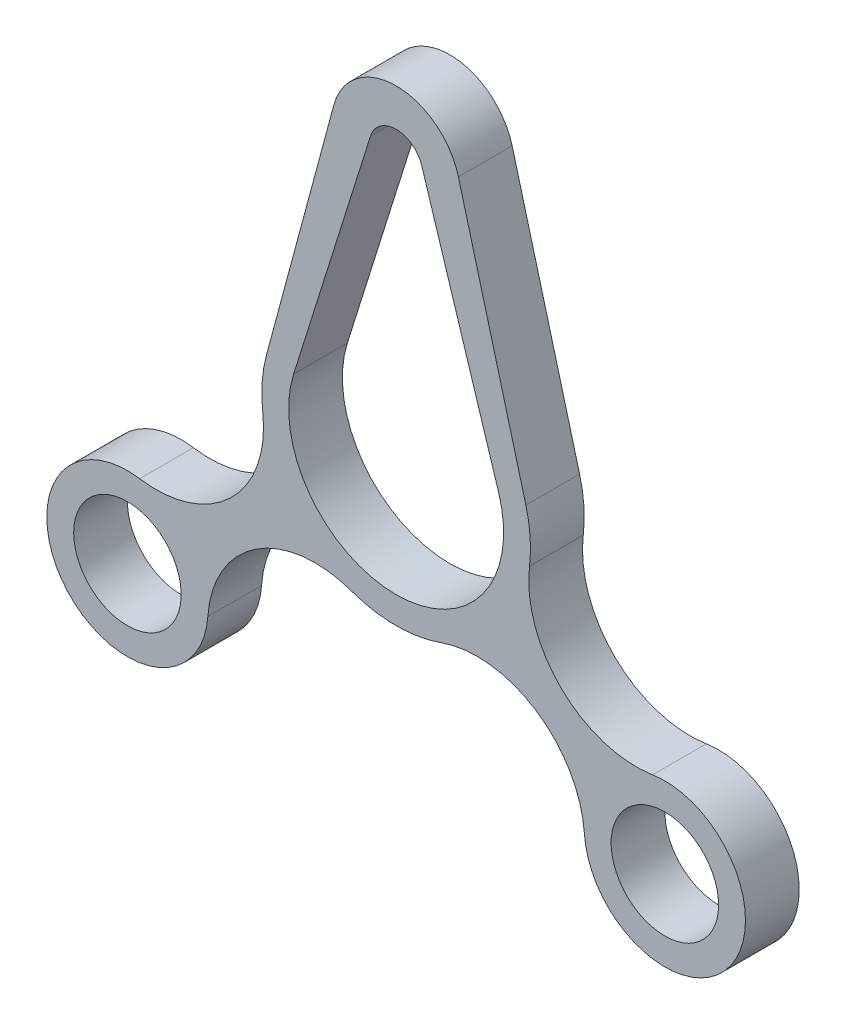
ISO-10303-21;
HEADER;
FILE_DESCRIPTION(('STEP AP214'),'2;1');
FILE_NAME('part.step','',(''),(''),'','','');
FILE_SCHEMA(('AUTOMOTIVE_DESIGN { 1 0 10303 214 1 1 1 1 }'));
ENDSEC;
DATA;
#1=APPLICATION_CONTEXT('core data for automotive mechanical design processes');
#2=APPLICATION_PROTOCOL_DEFINITION('international standard','automotive_design',2000,#1);
#3=PRODUCT_CONTEXT('',#1,'mechanical');
#4=PRODUCT('Part','Part','',(#3));
#5=PRODUCT_RELATED_PRODUCT_CATEGORY('part','',(#4));
#6=PRODUCT_DEFINITION_FORMATION('','',#4);
#7=PRODUCT_DEFINITION_CONTEXT('part definition',#1,'design');
#8=PRODUCT_DEFINITION('design','',#6,#7);
#9=PRODUCT_DEFINITION_SHAPE('','',#8);
#10=(LENGTH_UNIT() NAMED_UNIT(*) SI_UNIT(.MILLI.,.METRE.));
#11=(NAMED_UNIT(*) PLANE_ANGLE_UNIT() SI_UNIT($,.RADIAN.));
#12=(NAMED_UNIT(*) SI_UNIT($,.STERADIAN.) SOLID_ANGLE_UNIT());
#13=UNCERTAINTY_MEASURE_WITH_UNIT(LENGTH_MEASURE(1.E-05),#10,'distance_accuracy_value','');
#14=(GEOMETRIC_REPRESENTATION_CONTEXT(3) GLOBAL_UNCERTAINTY_ASSIGNED_CONTEXT((#13)) GLOBAL_UNIT_ASSIGNED_CONTEXT((#10,
#11,#12)) REPRESENTATION_CONTEXT('',''));
#15=CARTESIAN_POINT('',(0.,0.,0.));
#16=DIRECTION('',(0.,0.,1.));
#17=DIRECTION('',(1.,0.,0.));
#18=AXIS2_PLACEMENT_3D('',#15,#16,#17);
#19=CARTESIAN_POINT('',(0.,0.,5.));
#20=DIRECTION('',(0.,0.,1.));
#21=DIRECTION('',(1.,0.,0.));
#22=AXIS2_PLACEMENT_3D('',#19,#20,#21);
#23=PLANE('',#22);
#24=CARTESIAN_POINT('',(50.,-40.,5.));
#25=DIRECTION('',(0.,0.,1.));
#26=DIRECTION('',(1.,0.,0.));
#27=AXIS2_PLACEMENT_3D('',#24,#25,#26);
#28=CIRCLE('',#27,9.99999999999999);
#29=CARTESIAN_POINT('',(60.,-40.,5.));
#30=VERTEX_POINT('',#29);
#31=EDGE_CURVE('E213',#30,#30,#28,.T.);
#32=ORIENTED_EDGE('',*,*,#31,.F.);
#33=EDGE_LOOP('',(#32));
#34=FACE_BOUND('',#33,.T.);
#35=CARTESIAN_POINT('',(0.,0.,5.));
#36=DIRECTION('',(0.,0.,1.));
#37=DIRECTION('',(1.,0.,0.));
#38=AXIS2_PLACEMENT_3D('',#35,#36,#37);
#39=CIRCLE('',#38,25.);
#40=CARTESIAN_POINT('',(-8.37899680861621,-23.5540317670075,5.));
#41=VERTEX_POINT('',#40);
#42=CARTESIAN_POINT('',(8.37899680861621,-23.5540317670075,5.));
#43=VERTEX_POINT('',#42);
#44=EDGE_CURVE('E221',#41,#43,#39,.T.);
#45=ORIENTED_EDGE('',*,*,#44,.T.);
#46=CARTESIAN_POINT('',(15.0821942555092,-42.3972571806135,5.));
#47=DIRECTION('',(0.,0.,-1.));
#48=DIRECTION('',(-1.,0.,0.));
#49=AXIS2_PLACEMENT_3D('',#46,#47,#48);
#50=CIRCLE('',#49,20.);
#51=CARTESIAN_POINT('',(35.0352261095039,-41.0273959345487,5.));
#52=VERTEX_POINT('',#51);
#53=EDGE_CURVE('E225',#43,#52,#50,.T.);
#54=ORIENTED_EDGE('',*,*,#53,.T.);
#55=CARTESIAN_POINT('',(50.,-40.,5.));
#56=DIRECTION('',(0.,0.,1.));
#57=DIRECTION('',(1.,0.,0.));
#58=AXIS2_PLACEMENT_3D('',#55,#56,#57);
#59=CIRCLE('',#58,15.);
#60=CARTESIAN_POINT('',(47.7173871309142,-25.1746946577858,5.));
#61=VERTEX_POINT('',#60);
#62=EDGE_CURVE('E229',#52,#61,#59,.T.);
#63=ORIENTED_EDGE('',*,*,#62,.T.);
#64=CARTESIAN_POINT('',(44.6739033054664,-5.40762086816695,5.));
#65=DIRECTION('',(0.,0.,-1.));
#66=DIRECTION('',(1.,0.,0.));
#67=AXIS2_PLACEMENT_3D('',#64,#65,#66);
#68=CIRCLE('',#67,20.);
#69=CARTESIAN_POINT('',(24.8188351697036,-3.00423381564831,5.));
#70=VERTEX_POINT('',#69);
#71=EDGE_CURVE('E232',#61,#70,#68,.T.);
#72=ORIENTED_EDGE('',*,*,#71,.T.);
#73=CARTESIAN_POINT('',(0.,0.,5.));
#74=DIRECTION('',(0.,0.,1.));
#75=DIRECTION('',(1.,0.,0.));
#76=AXIS2_PLACEMENT_3D('',#73,#74,#75);
#77=CIRCLE('',#76,25.);
#78=CARTESIAN_POINT('',(24.1402154091466,6.5,5.));
#79=VERTEX_POINT('',#78);
#80=EDGE_CURVE('E235',#70,#79,#77,.T.);
#81=ORIENTED_EDGE('',*,*,#80,.T.);
#82=DIRECTION('',(-0.26,0.965608616365865,0.));
#83=VECTOR('',#82,1.);
#84=CARTESIAN_POINT('',(11.5873033963904,53.12,5.));
#85=LINE('',#84,#83);
#86=CARTESIAN_POINT('',(11.5873033963904,53.12,5.));
#87=VERTEX_POINT('',#86);
#88=EDGE_CURVE('E238',#79,#87,#85,.T.);
#89=ORIENTED_EDGE('',*,*,#88,.T.);
#90=CARTESIAN_POINT('',(0.,50.,5.));
#91=DIRECTION('',(0.,0.,1.));
#92=DIRECTION('',(1.,0.,0.));
#93=AXIS2_PLACEMENT_3D('',#90,#91,#92);
#94=CIRCLE('',#93,12.);
#95=CARTESIAN_POINT('',(-11.5873033963904,53.12,5.));
#96=VERTEX_POINT('',#95);
#97=EDGE_CURVE('E241',#87,#96,#94,.T.);
#98=ORIENTED_EDGE('',*,*,#97,.T.);
#99=DIRECTION('',(-0.26,-0.965608616365865,0.));
#100=VECTOR('',#99,1.);
#101=CARTESIAN_POINT('',(-11.5873033963904,53.12,5.));
#102=LINE('',#101,#100);
#103=CARTESIAN_POINT('',(-24.1402154091466,6.5,5.));
#104=VERTEX_POINT('',#103);
#105=EDGE_CURVE('E244',#96,#104,#102,.T.);
#106=ORIENTED_EDGE('',*,*,#105,.T.);
#107=CARTESIAN_POINT('',(0.,0.,5.));
#108=DIRECTION('',(0.,0.,1.));
#109=DIRECTION('',(1.,0.,0.));
#110=AXIS2_PLACEMENT_3D('',#107,#108,#109);
#111=CIRCLE('',#110,25.);
#112=CARTESIAN_POINT('',(-24.8188351697036,-3.0042338156483,5.));
#113=VERTEX_POINT('',#112);
#114=EDGE_CURVE('E247',#104,#113,#111,.T.);
#115=ORIENTED_EDGE('',*,*,#114,.T.);
#116=CARTESIAN_POINT('',(-44.6739033054664,-5.40762086816695,5.));
#117=DIRECTION('',(0.,0.,-1.));
#118=DIRECTION('',(-1.,0.,0.));
#119=AXIS2_PLACEMENT_3D('',#116,#117,#118);
#120=CIRCLE('',#119,20.);
#121=CARTESIAN_POINT('',(-47.7173871309142,-25.1746946577858,5.));
#122=VERTEX_POINT('',#121);
#123=EDGE_CURVE('E250',#113,#122,#120,.T.);
#124=ORIENTED_EDGE('',*,*,#123,.T.);
#125=CARTESIAN_POINT('',(-50.,-40.,5.));
#126=DIRECTION('',(0.,0.,1.));
#127=DIRECTION('',(-1.,0.,0.));
#128=AXIS2_PLACEMENT_3D('',#125,#126,#127);
#129=CIRCLE('',#128,15.);
#130=CARTESIAN_POINT('',(-35.0352261095039,-41.0273959345487,5.));
#131=VERTEX_POINT('',#130);
#132=EDGE_CURVE('E253',#122,#131,#129,.T.);
#133=ORIENTED_EDGE('',*,*,#132,.T.);
#134=CARTESIAN_POINT('',(-15.0821942555092,-42.3972571806135,5.));
#135=DIRECTION('',(0.,0.,-1.));
#136=DIRECTION('',(1.,0.,0.));
#137=AXIS2_PLACEMENT_3D('',#134,#135,#136);
#138=CIRCLE('',#137,20.);
#139=EDGE_CURVE('E256',#131,#41,#138,.T.);
#140=ORIENTED_EDGE('',*,*,#139,.T.);
#141=EDGE_LOOP('',(#45,#54,#63,#72,#81,#89,#98,#106,#115,#124,#133,#140));
#142=FACE_BOUND('',#141,.T.);
#143=CARTESIAN_POINT('',(-50.,-40.,5.));
#144=DIRECTION('',(0.,0.,1.));
#145=DIRECTION('',(-1.,0.,0.));
#146=AXIS2_PLACEMENT_3D('',#143,#144,#145);
#147=CIRCLE('',#146,9.99999999999999);
#148=CARTESIAN_POINT('',(-60.,-40.,5.));
#149=VERTEX_POINT('',#148);
#150=EDGE_CURVE('E205',#149,#149,#147,.T.);
#151=ORIENTED_EDGE('',*,*,#150,.F.);
#152=EDGE_LOOP('',(#151));
#153=FACE_BOUND('',#152,.T.);
#154=DIRECTION('',(-0.3,-0.953939201416946,0.));
#155=VECTOR('',#154,1.);
#156=CARTESIAN_POINT('',(-4.76969600708473,51.5,5.));
#157=LINE('',#156,#155);
#158=CARTESIAN_POINT('',(-4.76969600708473,51.5,5.));
#159=VERTEX_POINT('',#158);
#160=CARTESIAN_POINT('',(-19.0787840283389,6.,5.));
#161=VERTEX_POINT('',#160);
#162=EDGE_CURVE('E166',#159,#161,#157,.T.);
#163=ORIENTED_EDGE('',*,*,#162,.F.);
#164=CARTESIAN_POINT('',(0.,50.,5.));
#165=DIRECTION('',(0.,0.,1.));
#166=DIRECTION('',(1.,0.,0.));
#167=AXIS2_PLACEMENT_3D('',#164,#165,#166);
#168=CIRCLE('',#167,5.);
#169=CARTESIAN_POINT('',(4.76969600708473,51.5,5.));
#170=VERTEX_POINT('',#169);
#171=EDGE_CURVE('E157',#170,#159,#168,.T.);
#172=ORIENTED_EDGE('',*,*,#171,.F.);
#173=DIRECTION('',(-0.3,0.953939201416946,0.));
#174=VECTOR('',#173,1.);
#175=CARTESIAN_POINT('',(4.76969600708473,51.5,5.));
#176=LINE('',#175,#174);
#177=CARTESIAN_POINT('',(19.0787840283389,6.,5.));
#178=VERTEX_POINT('',#177);
#179=EDGE_CURVE('E183',#178,#170,#176,.T.);
#180=ORIENTED_EDGE('',*,*,#179,.F.);
#181=CARTESIAN_POINT('',(0.,0.,5.));
#182=DIRECTION('',(0.,0.,1.));
#183=DIRECTION('',(1.,0.,0.));
#184=AXIS2_PLACEMENT_3D('',#181,#182,#183);
#185=CIRCLE('',#184,20.);
#186=EDGE_CURVE('E179',#161,#178,#185,.T.);
#187=ORIENTED_EDGE('',*,*,#186,.F.);
#188=EDGE_LOOP('',(#163,#172,#180,#187));
#189=FACE_BOUND('',#188,.T.);
#190=ADVANCED_FACE('F43',(#34,#142,#153,#189),#23,.T.);
#191=CARTESIAN_POINT('',(0.,0.,-5.));
#192=DIRECTION('',(0.,0.,1.));
#193=DIRECTION('',(1.,0.,0.));
#194=AXIS2_PLACEMENT_3D('',#191,#192,#193);
#195=PLANE('',#194);
#196=CARTESIAN_POINT('',(-50.,-40.,-5.));
#197=DIRECTION('',(0.,0.,1.));
#198=DIRECTION('',(-1.,0.,0.));
#199=AXIS2_PLACEMENT_3D('',#196,#197,#198);
#200=CIRCLE('',#199,9.99999999999999);
#201=CARTESIAN_POINT('',(-60.,-40.,-5.));
#202=VERTEX_POINT('',#201);
#203=EDGE_CURVE('E175',#202,#202,#200,.T.);
#204=ORIENTED_EDGE('',*,*,#203,.T.);
#205=EDGE_LOOP('',(#204));
#206=FACE_BOUND('',#205,.T.);
#207=CARTESIAN_POINT('',(50.,-40.,-5.));
#208=DIRECTION('',(0.,0.,1.));
#209=DIRECTION('',(1.,0.,0.));
#210=AXIS2_PLACEMENT_3D('',#207,#208,#209);
#211=CIRCLE('',#210,9.99999999999999);
#212=CARTESIAN_POINT('',(60.,-40.,-5.));
#213=VERTEX_POINT('',#212);
#214=EDGE_CURVE('E209',#213,#213,#211,.T.);
#215=ORIENTED_EDGE('',*,*,#214,.T.);
#216=EDGE_LOOP('',(#215));
#217=FACE_BOUND('',#216,.T.);
#218=CARTESIAN_POINT('',(0.,0.,-5.));
#219=DIRECTION('',(0.,0.,1.));
#220=DIRECTION('',(1.,0.,0.));
#221=AXIS2_PLACEMENT_3D('',#218,#219,#220);
#222=CIRCLE('',#221,25.);
#223=CARTESIAN_POINT('',(-8.37899680861621,-23.5540317670075,-5.));
#224=VERTEX_POINT('',#223);
#225=CARTESIAN_POINT('',(8.37899680861621,-23.5540317670075,-5.));
#226=VERTEX_POINT('',#225);
#227=EDGE_CURVE('E217',#224,#226,#222,.T.);
#228=ORIENTED_EDGE('',*,*,#227,.F.);
#229=CARTESIAN_POINT('',(-15.0821942555092,-42.3972571806135,-5.));
#230=DIRECTION('',(0.,0.,-1.));
#231=DIRECTION('',(1.,0.,0.));
#232=AXIS2_PLACEMENT_3D('',#229,#230,#231);
#233=CIRCLE('',#232,20.);
#234=CARTESIAN_POINT('',(-35.0352261095039,-41.0273959345487,-5.));
#235=VERTEX_POINT('',#234);
#236=EDGE_CURVE('E226',#235,#224,#233,.T.);
#237=ORIENTED_EDGE('',*,*,#236,.F.);
#238=CARTESIAN_POINT('',(-50.,-40.,-5.));
#239=DIRECTION('',(0.,0.,1.));
#240=DIRECTION('',(-1.,0.,0.));
#241=AXIS2_PLACEMENT_3D('',#238,#239,#240);
#242=CIRCLE('',#241,15.);
#243=CARTESIAN_POINT('',(-47.7173871309142,-25.1746946577858,-5.));
#244=VERTEX_POINT('',#243);
#245=EDGE_CURVE('E290',#244,#235,#242,.T.);
#246=ORIENTED_EDGE('',*,*,#245,.F.);
#247=CARTESIAN_POINT('',(-44.6739033054664,-5.40762086816695,-5.));
#248=DIRECTION('',(0.,0.,-1.));
#249=DIRECTION('',(-1.,0.,0.));
#250=AXIS2_PLACEMENT_3D('',#247,#248,#249);
#251=CIRCLE('',#250,20.);
#252=CARTESIAN_POINT('',(-24.8188351697036,-3.0042338156483,-5.));
#253=VERTEX_POINT('',#252);
#254=EDGE_CURVE('E287',#253,#244,#251,.T.);
#255=ORIENTED_EDGE('',*,*,#254,.F.);
#256=CARTESIAN_POINT('',(0.,0.,-5.));
#257=DIRECTION('',(0.,0.,1.));
#258=DIRECTION('',(1.,0.,0.));
#259=AXIS2_PLACEMENT_3D('',#256,#257,#258);
#260=CIRCLE('',#259,25.);
#261=CARTESIAN_POINT('',(-24.1402154091466,6.5,-5.));
#262=VERTEX_POINT('',#261);
#263=EDGE_CURVE('E284',#262,#253,#260,.T.);
#264=ORIENTED_EDGE('',*,*,#263,.F.);
#265=DIRECTION('',(-0.26,-0.965608616365865,0.));
#266=VECTOR('',#265,1.);
#267=CARTESIAN_POINT('',(-11.5873033963904,53.12,-5.));
#268=LINE('',#267,#266);
#269=CARTESIAN_POINT('',(-11.5873033963904,53.12,-5.));
#270=VERTEX_POINT('',#269);
#271=EDGE_CURVE('E281',#270,#262,#268,.T.);
#272=ORIENTED_EDGE('',*,*,#271,.F.);
#273=CARTESIAN_POINT('',(0.,50.,-5.));
#274=DIRECTION('',(0.,0.,1.));
#275=DIRECTION('',(1.,0.,0.));
#276=AXIS2_PLACEMENT_3D('',#273,#274,#275);
#277=CIRCLE('',#276,12.);
#278=CARTESIAN_POINT('',(11.5873033963904,53.12,-5.));
#279=VERTEX_POINT('',#278);
#280=EDGE_CURVE('E278',#279,#270,#277,.T.);
#281=ORIENTED_EDGE('',*,*,#280,.F.);
#282=DIRECTION('',(-0.26,0.965608616365865,0.));
#283=VECTOR('',#282,1.);
#284=CARTESIAN_POINT('',(11.5873033963904,53.12,-5.));
#285=LINE('',#284,#283);
#286=CARTESIAN_POINT('',(24.1402154091466,6.5,-5.));
#287=VERTEX_POINT('',#286);
#288=EDGE_CURVE('E275',#287,#279,#285,.T.);
#289=ORIENTED_EDGE('',*,*,#288,.F.);
#290=CARTESIAN_POINT('',(0.,0.,-5.));
#291=DIRECTION('',(0.,0.,1.));
#292=DIRECTION('',(1.,0.,0.));
#293=AXIS2_PLACEMENT_3D('',#290,#291,#292);
#294=CIRCLE('',#293,25.);
#295=CARTESIAN_POINT('',(24.8188351697036,-3.00423381564831,-5.));
#296=VERTEX_POINT('',#295);
#297=EDGE_CURVE('E272',#296,#287,#294,.T.);
#298=ORIENTED_EDGE('',*,*,#297,.F.);
#299=CARTESIAN_POINT('',(44.6739033054664,-5.40762086816695,-5.));
#300=DIRECTION('',(0.,0.,-1.));
#301=DIRECTION('',(1.,0.,0.));
#302=AXIS2_PLACEMENT_3D('',#299,#300,#301);
#303=CIRCLE('',#302,20.);
#304=CARTESIAN_POINT('',(47.7173871309142,-25.1746946577858,-5.));
#305=VERTEX_POINT('',#304);
#306=EDGE_CURVE('E269',#305,#296,#303,.T.);
#307=ORIENTED_EDGE('',*,*,#306,.F.);
#308=CARTESIAN_POINT('',(50.,-40.,-5.));
#309=DIRECTION('',(0.,0.,1.));
#310=DIRECTION('',(1.,0.,0.));
#311=AXIS2_PLACEMENT_3D('',#308,#309,#310);
#312=CIRCLE('',#311,15.);
#313=CARTESIAN_POINT('',(35.0352261095039,-41.0273959345487,-5.));
#314=VERTEX_POINT('',#313);
#315=EDGE_CURVE('E266',#314,#305,#312,.T.);
#316=ORIENTED_EDGE('',*,*,#315,.F.);
#317=CARTESIAN_POINT('',(15.0821942555092,-42.3972571806135,-5.));
#318=DIRECTION('',(0.,0.,-1.));
#319=DIRECTION('',(-1.,0.,0.));
#320=AXIS2_PLACEMENT_3D('',#317,#318,#319);
#321=CIRCLE('',#320,20.);
#322=EDGE_CURVE('E263',#226,#314,#321,.T.);
#323=ORIENTED_EDGE('',*,*,#322,.F.);
#324=EDGE_LOOP('',(#228,#237,#246,#255,#264,#272,#281,#289,#298,#307,#316,#323));
#325=FACE_BOUND('',#324,.T.);
#326=CARTESIAN_POINT('',(0.,50.,-5.));
#327=DIRECTION('',(0.,0.,1.));
#328=DIRECTION('',(1.,0.,0.));
#329=AXIS2_PLACEMENT_3D('',#326,#327,#328);
#330=CIRCLE('',#329,5.);
#331=CARTESIAN_POINT('',(4.76969600708473,51.5,-5.));
#332=VERTEX_POINT('',#331);
#333=CARTESIAN_POINT('',(-4.76969600708473,51.5,-5.));
#334=VERTEX_POINT('',#333);
#335=EDGE_CURVE('E67',#332,#334,#330,.T.);
#336=ORIENTED_EDGE('',*,*,#335,.T.);
#337=DIRECTION('',(-0.3,-0.953939201416946,0.));
#338=VECTOR('',#337,1.);
#339=CARTESIAN_POINT('',(-4.76969600708473,51.5,-5.));
#340=LINE('',#339,#338);
#341=CARTESIAN_POINT('',(-19.0787840283389,6.,-5.));
#342=VERTEX_POINT('',#341);
#343=EDGE_CURVE('E173',#334,#342,#340,.T.);
#344=ORIENTED_EDGE('',*,*,#343,.T.);
#345=CARTESIAN_POINT('',(0.,0.,-5.));
#346=DIRECTION('',(0.,0.,1.));
#347=DIRECTION('',(1.,0.,0.));
#348=AXIS2_PLACEMENT_3D('',#345,#346,#347);
#349=CIRCLE('',#348,20.);
#350=CARTESIAN_POINT('',(19.0787840283389,6.,-5.));
#351=VERTEX_POINT('',#350);
#352=EDGE_CURVE('E192',#342,#351,#349,.T.);
#353=ORIENTED_EDGE('',*,*,#352,.T.);
#354=DIRECTION('',(-0.3,0.953939201416946,0.));
#355=VECTOR('',#354,1.);
#356=CARTESIAN_POINT('',(4.76969600708473,51.5,-5.));
#357=LINE('',#356,#355);
#358=EDGE_CURVE('E167',#351,#332,#357,.T.);
#359=ORIENTED_EDGE('',*,*,#358,.T.);
#360=EDGE_LOOP('',(#336,#344,#353,#359));
#361=FACE_BOUND('',#360,.T.);
#362=ADVANCED_FACE('F345',(#206,#217,#325,#361),#195,.F.);
#363=CARTESIAN_POINT('',(0.,0.,5.));
#364=DIRECTION('',(0.,0.,-1.));
#365=DIRECTION('',(-1.,0.,0.));
#366=AXIS2_PLACEMENT_3D('',#363,#364,#365);
#367=CYLINDRICAL_SURFACE('',#366,25.);
#368=ORIENTED_EDGE('',*,*,#227,.T.);
#369=DIRECTION('',(0.,0.,-1.));
#370=VECTOR('',#369,1.);
#371=CARTESIAN_POINT('',(8.37899680861621,-23.5540317670075,5.));
#372=LINE('',#371,#370);
#373=EDGE_CURVE('E11',#43,#226,#372,.T.);
#374=ORIENTED_EDGE('',*,*,#373,.F.);
#375=ORIENTED_EDGE('',*,*,#44,.F.);
#376=DIRECTION('',(0.,0.,-1.));
#377=VECTOR('',#376,1.);
#378=CARTESIAN_POINT('',(-8.37899680861621,-23.5540317670075,5.));
#379=LINE('',#378,#377);
#380=EDGE_CURVE('E259',#41,#224,#379,.T.);
#381=ORIENTED_EDGE('',*,*,#380,.T.);
#382=EDGE_LOOP('',(#368,#374,#375,#381));
#383=FACE_BOUND('',#382,.T.);
#384=ADVANCED_FACE('F45',(#383),#367,.T.);
#385=CARTESIAN_POINT('',(15.0821942555092,-42.3972571806135,5.));
#386=DIRECTION('',(0.,0.,-1.));
#387=DIRECTION('',(-1.,0.,0.));
#388=AXIS2_PLACEMENT_3D('',#385,#386,#387);
#389=CYLINDRICAL_SURFACE('',#388,20.);
#390=ORIENTED_EDGE('',*,*,#322,.T.);
#391=DIRECTION('',(0.,0.,-1.));
#392=VECTOR('',#391,1.);
#393=CARTESIAN_POINT('',(35.0352261095039,-41.0273959345487,5.));
#394=LINE('',#393,#392);
#395=EDGE_CURVE('E52',#52,#314,#394,.T.);
#396=ORIENTED_EDGE('',*,*,#395,.F.);
#397=ORIENTED_EDGE('',*,*,#53,.F.);
#398=ORIENTED_EDGE('',*,*,#373,.T.);
#399=EDGE_LOOP('',(#390,#396,#397,#398));
#400=FACE_BOUND('',#399,.T.);
#401=ADVANCED_FACE('F363',(#400),#389,.F.);
#402=CARTESIAN_POINT('',(50.,-40.,5.));
#403=DIRECTION('',(0.,0.,-1.));
#404=DIRECTION('',(-1.,0.,0.));
#405=AXIS2_PLACEMENT_3D('',#402,#403,#404);
#406=CYLINDRICAL_SURFACE('',#405,15.);
#407=ORIENTED_EDGE('',*,*,#315,.T.);
#408=DIRECTION('',(0.,0.,-1.));
#409=VECTOR('',#408,1.);
#410=CARTESIAN_POINT('',(47.7173871309142,-25.1746946577858,5.));
#411=LINE('',#410,#409);
#412=EDGE_CURVE('E330',#61,#305,#411,.T.);
#413=ORIENTED_EDGE('',*,*,#412,.F.);
#414=ORIENTED_EDGE('',*,*,#62,.F.);
#415=ORIENTED_EDGE('',*,*,#395,.T.);
#416=EDGE_LOOP('',(#407,#413,#414,#415));
#417=FACE_BOUND('',#416,.T.);
#418=ADVANCED_FACE('F339',(#417),#406,.T.);
#419=CARTESIAN_POINT('',(44.6739033054664,-5.40762086816695,5.));
#420=DIRECTION('',(0.,0.,-1.));
#421=DIRECTION('',(-1.,0.,0.));
#422=AXIS2_PLACEMENT_3D('',#419,#420,#421);
#423=CYLINDRICAL_SURFACE('',#422,20.);
#424=ORIENTED_EDGE('',*,*,#306,.T.);
#425=DIRECTION('',(0.,0.,-1.));
#426=VECTOR('',#425,1.);
#427=CARTESIAN_POINT('',(24.8188351697036,-3.00423381564831,5.));
#428=LINE('',#427,#426);
#429=EDGE_CURVE('E326',#70,#296,#428,.T.);
#430=ORIENTED_EDGE('',*,*,#429,.F.);
#431=ORIENTED_EDGE('',*,*,#71,.F.);
#432=ORIENTED_EDGE('',*,*,#412,.T.);
#433=EDGE_LOOP('',(#424,#430,#431,#432));
#434=FACE_BOUND('',#433,.T.);
#435=ADVANCED_FACE('F351',(#434),#423,.F.);
#436=CARTESIAN_POINT('',(0.,0.,5.));
#437=DIRECTION('',(0.,0.,-1.));
#438=DIRECTION('',(-1.,0.,0.));
#439=AXIS2_PLACEMENT_3D('',#436,#437,#438);
#440=CYLINDRICAL_SURFACE('',#439,25.);
#441=ORIENTED_EDGE('',*,*,#297,.T.);
#442=DIRECTION('',(0.,0.,-1.));
#443=VECTOR('',#442,1.);
#444=CARTESIAN_POINT('',(24.1402154091466,6.5,5.));
#445=LINE('',#444,#443);
#446=EDGE_CURVE('E322',#79,#287,#445,.T.);
#447=ORIENTED_EDGE('',*,*,#446,.F.);
#448=ORIENTED_EDGE('',*,*,#80,.F.);
#449=ORIENTED_EDGE('',*,*,#429,.T.);
#450=EDGE_LOOP('',(#441,#447,#448,#449));
#451=FACE_BOUND('',#450,.T.);
#452=ADVANCED_FACE('F355',(#451),#440,.T.);
#453=CARTESIAN_POINT('',(11.5873033963904,53.12,5.));
#454=DIRECTION('',(-0.965608616365865,-0.26,0.));
#455=DIRECTION('',(0.26,-0.965608616365865,0.));
#456=AXIS2_PLACEMENT_3D('',#453,#454,#455);
#457=PLANE('',#456);
#458=ORIENTED_EDGE('',*,*,#288,.T.);
#459=DIRECTION('',(0.,0.,-1.));
#460=VECTOR('',#459,1.);
#461=CARTESIAN_POINT('',(11.5873033963904,53.12,5.));
#462=LINE('',#461,#460);
#463=EDGE_CURVE('E318',#87,#279,#462,.T.);
#464=ORIENTED_EDGE('',*,*,#463,.F.);
#465=ORIENTED_EDGE('',*,*,#88,.F.);
#466=ORIENTED_EDGE('',*,*,#446,.T.);
#467=EDGE_LOOP('',(#458,#464,#465,#466));
#468=FACE_BOUND('',#467,.T.);
#469=ADVANCED_FACE('F396',(#468),#457,.F.);
#470=CARTESIAN_POINT('',(0.,50.,5.));
#471=DIRECTION('',(0.,0.,-1.));
#472=DIRECTION('',(-1.,0.,0.));
#473=AXIS2_PLACEMENT_3D('',#470,#471,#472);
#474=CYLINDRICAL_SURFACE('',#473,12.);
#475=ORIENTED_EDGE('',*,*,#280,.T.);
#476=DIRECTION('',(0.,0.,-1.));
#477=VECTOR('',#476,1.);
#478=CARTESIAN_POINT('',(-11.5873033963904,53.12,5.));
#479=LINE('',#478,#477);
#480=EDGE_CURVE('E314',#96,#270,#479,.T.);
#481=ORIENTED_EDGE('',*,*,#480,.F.);
#482=ORIENTED_EDGE('',*,*,#97,.F.);
#483=ORIENTED_EDGE('',*,*,#463,.T.);
#484=EDGE_LOOP('',(#475,#481,#482,#483));
#485=FACE_BOUND('',#484,.T.);
#486=ADVANCED_FACE('F394',(#485),#474,.T.);
#487=CARTESIAN_POINT('',(-11.5873033963904,53.12,5.));
#488=DIRECTION('',(0.965608616365865,-0.26,0.));
#489=DIRECTION('',(0.26,0.965608616365865,0.));
#490=AXIS2_PLACEMENT_3D('',#487,#488,#489);
#491=PLANE('',#490);
#492=ORIENTED_EDGE('',*,*,#271,.T.);
#493=DIRECTION('',(0.,0.,-1.));
#494=VECTOR('',#493,1.);
#495=CARTESIAN_POINT('',(-24.1402154091466,6.5,5.));
#496=LINE('',#495,#494);
#497=EDGE_CURVE('E310',#104,#262,#496,.T.);
#498=ORIENTED_EDGE('',*,*,#497,.F.);
#499=ORIENTED_EDGE('',*,*,#105,.F.);
#500=ORIENTED_EDGE('',*,*,#480,.T.);
#501=EDGE_LOOP('',(#492,#498,#499,#500));
#502=FACE_BOUND('',#501,.T.);
#503=ADVANCED_FACE('F390',(#502),#491,.F.);
#504=CARTESIAN_POINT('',(0.,0.,5.));
#505=DIRECTION('',(0.,0.,-1.));
#506=DIRECTION('',(-1.,0.,0.));
#507=AXIS2_PLACEMENT_3D('',#504,#505,#506);
#508=CYLINDRICAL_SURFACE('',#507,25.);
#509=ORIENTED_EDGE('',*,*,#263,.T.);
#510=DIRECTION('',(0.,0.,-1.));
#511=VECTOR('',#510,1.);
#512=CARTESIAN_POINT('',(-24.8188351697036,-3.0042338156483,5.));
#513=LINE('',#512,#511);
#514=EDGE_CURVE('E306',#113,#253,#513,.T.);
#515=ORIENTED_EDGE('',*,*,#514,.F.);
#516=ORIENTED_EDGE('',*,*,#114,.F.);
#517=ORIENTED_EDGE('',*,*,#497,.T.);
#518=EDGE_LOOP('',(#509,#515,#516,#517));
#519=FACE_BOUND('',#518,.T.);
#520=ADVANCED_FACE('F385',(#519),#508,.T.);
#521=CARTESIAN_POINT('',(-44.6739033054664,-5.40762086816695,5.));
#522=DIRECTION('',(0.,0.,-1.));
#523=DIRECTION('',(-1.,0.,0.));
#524=AXIS2_PLACEMENT_3D('',#521,#522,#523);
#525=CYLINDRICAL_SURFACE('',#524,20.);
#526=ORIENTED_EDGE('',*,*,#254,.T.);
#527=DIRECTION('',(0.,0.,-1.));
#528=VECTOR('',#527,1.);
#529=CARTESIAN_POINT('',(-47.7173871309142,-25.1746946577858,5.));
#530=LINE('',#529,#528);
#531=EDGE_CURVE('E302',#122,#244,#530,.T.);
#532=ORIENTED_EDGE('',*,*,#531,.F.);
#533=ORIENTED_EDGE('',*,*,#123,.F.);
#534=ORIENTED_EDGE('',*,*,#514,.T.);
#535=EDGE_LOOP('',(#526,#532,#533,#534));
#536=FACE_BOUND('',#535,.T.);
#537=ADVANCED_FACE('F379',(#536),#525,.F.);
#538=CARTESIAN_POINT('',(-50.,-40.,5.));
#539=DIRECTION('',(0.,0.,-1.));
#540=DIRECTION('',(-1.,0.,0.));
#541=AXIS2_PLACEMENT_3D('',#538,#539,#540);
#542=CYLINDRICAL_SURFACE('',#541,15.);
#543=ORIENTED_EDGE('',*,*,#245,.T.);
#544=DIRECTION('',(0.,0.,-1.));
#545=VECTOR('',#544,1.);
#546=CARTESIAN_POINT('',(-35.0352261095039,-41.0273959345487,5.));
#547=LINE('',#546,#545);
#548=EDGE_CURVE('E298',#131,#235,#547,.T.);
#549=ORIENTED_EDGE('',*,*,#548,.F.);
#550=ORIENTED_EDGE('',*,*,#132,.F.);
#551=ORIENTED_EDGE('',*,*,#531,.T.);
#552=EDGE_LOOP('',(#543,#549,#550,#551));
#553=FACE_BOUND('',#552,.T.);
#554=ADVANCED_FACE('F375',(#553),#542,.T.);
#555=CARTESIAN_POINT('',(-15.0821942555092,-42.3972571806135,5.));
#556=DIRECTION('',(0.,0.,-1.));
#557=DIRECTION('',(-1.,0.,0.));
#558=AXIS2_PLACEMENT_3D('',#555,#556,#557);
#559=CYLINDRICAL_SURFACE('',#558,20.);
#560=ORIENTED_EDGE('',*,*,#236,.T.);
#561=ORIENTED_EDGE('',*,*,#380,.F.);
#562=ORIENTED_EDGE('',*,*,#139,.F.);
#563=ORIENTED_EDGE('',*,*,#548,.T.);
#564=EDGE_LOOP('',(#560,#561,#562,#563));
#565=FACE_BOUND('',#564,.T.);
#566=ADVANCED_FACE('F370',(#565),#559,.F.);
#567=CARTESIAN_POINT('',(50.,-40.,5.));
#568=DIRECTION('',(0.,0.,-1.));
#569=DIRECTION('',(-1.,0.,0.));
#570=AXIS2_PLACEMENT_3D('',#567,#568,#569);
#571=CYLINDRICAL_SURFACE('',#570,9.99999999999999);
#572=ORIENTED_EDGE('',*,*,#31,.T.);
#573=EDGE_LOOP('',(#572));
#574=FACE_BOUND('',#573,.T.);
#575=ORIENTED_EDGE('',*,*,#214,.F.);
#576=EDGE_LOOP('',(#575));
#577=FACE_BOUND('',#576,.T.);
#578=ADVANCED_FACE('F415',(#574,#577),#571,.F.);
#579=CARTESIAN_POINT('',(-50.,-40.,5.));
#580=DIRECTION('',(0.,0.,-1.));
#581=DIRECTION('',(-1.,0.,0.));
#582=AXIS2_PLACEMENT_3D('',#579,#580,#581);
#583=CYLINDRICAL_SURFACE('',#582,9.99999999999999);
#584=ORIENTED_EDGE('',*,*,#150,.T.);
#585=EDGE_LOOP('',(#584));
#586=FACE_BOUND('',#585,.T.);
#587=ORIENTED_EDGE('',*,*,#203,.F.);
#588=EDGE_LOOP('',(#587));
#589=FACE_BOUND('',#588,.T.);
#590=ADVANCED_FACE('F453',(#586,#589),#583,.F.);
#591=CARTESIAN_POINT('',(0.,50.,5.));
#592=DIRECTION('',(0.,0.,-1.));
#593=DIRECTION('',(-1.,0.,0.));
#594=AXIS2_PLACEMENT_3D('',#591,#592,#593);
#595=CYLINDRICAL_SURFACE('',#594,5.);
#596=ORIENTED_EDGE('',*,*,#335,.F.);
#597=DIRECTION('',(0.,0.,-1.));
#598=VECTOR('',#597,1.);
#599=CARTESIAN_POINT('',(4.76969600708473,51.5,5.));
#600=LINE('',#599,#598);
#601=EDGE_CURVE('E161',#170,#332,#600,.T.);
#602=ORIENTED_EDGE('',*,*,#601,.F.);
#603=ORIENTED_EDGE('',*,*,#171,.T.);
#604=DIRECTION('',(0.,0.,-1.));
#605=VECTOR('',#604,1.);
#606=CARTESIAN_POINT('',(-4.76969600708473,51.5,5.));
#607=LINE('',#606,#605);
#608=EDGE_CURVE('E160',#159,#334,#607,.T.);
#609=ORIENTED_EDGE('',*,*,#608,.T.);
#610=EDGE_LOOP('',(#596,#602,#603,#609));
#611=FACE_BOUND('',#610,.T.);
#612=ADVANCED_FACE('F159',(#611),#595,.F.);
#613=CARTESIAN_POINT('',(-4.76969600708473,51.5,5.));
#614=DIRECTION('',(0.953939201416946,-0.3,0.));
#615=DIRECTION('',(0.3,0.953939201416946,0.));
#616=AXIS2_PLACEMENT_3D('',#613,#614,#615);
#617=PLANE('',#616);
#618=ORIENTED_EDGE('',*,*,#343,.F.);
#619=ORIENTED_EDGE('',*,*,#608,.F.);
#620=ORIENTED_EDGE('',*,*,#162,.T.);
#621=DIRECTION('',(0.,0.,-1.));
#622=VECTOR('',#621,1.);
#623=CARTESIAN_POINT('',(-19.0787840283389,6.,5.));
#624=LINE('',#623,#622);
#625=EDGE_CURVE('E176',#161,#342,#624,.T.);
#626=ORIENTED_EDGE('',*,*,#625,.T.);
#627=EDGE_LOOP('',(#618,#619,#620,#626));
#628=FACE_BOUND('',#627,.T.);
#629=ADVANCED_FACE('F170',(#628),#617,.T.);
#630=CARTESIAN_POINT('',(0.,0.,5.));
#631=DIRECTION('',(0.,0.,-1.));
#632=DIRECTION('',(-1.,0.,0.));
#633=AXIS2_PLACEMENT_3D('',#630,#631,#632);
#634=CYLINDRICAL_SURFACE('',#633,20.);
#635=ORIENTED_EDGE('',*,*,#352,.F.);
#636=ORIENTED_EDGE('',*,*,#625,.F.);
#637=ORIENTED_EDGE('',*,*,#186,.T.);
#638=DIRECTION('',(0.,0.,-1.));
#639=VECTOR('',#638,1.);
#640=CARTESIAN_POINT('',(19.0787840283389,6.,5.));
#641=LINE('',#640,#639);
#642=EDGE_CURVE('E59',#178,#351,#641,.T.);
#643=ORIENTED_EDGE('',*,*,#642,.T.);
#644=EDGE_LOOP('',(#635,#636,#637,#643));
#645=FACE_BOUND('',#644,.T.);
#646=ADVANCED_FACE('F472',(#645),#634,.F.);
#647=CARTESIAN_POINT('',(4.76969600708473,51.5,5.));
#648=DIRECTION('',(-0.953939201416946,-0.3,0.));
#649=DIRECTION('',(0.3,-0.953939201416946,0.));
#650=AXIS2_PLACEMENT_3D('',#647,#648,#649);
#651=PLANE('',#650);
#652=ORIENTED_EDGE('',*,*,#358,.F.);
#653=ORIENTED_EDGE('',*,*,#642,.F.);
#654=ORIENTED_EDGE('',*,*,#179,.T.);
#655=ORIENTED_EDGE('',*,*,#601,.T.);
#656=EDGE_LOOP('',(#652,#653,#654,#655));
#657=FACE_BOUND('',#656,.T.);
#658=ADVANCED_FACE('F479',(#657),#651,.T.);
#659=CLOSED_SHELL('',(#190,#362,#384,#401,#418,#435,#452,#469,#486,#503,#520,#537,#554,#566,
#578,#590,#612,#629,#646,#658));
#660=MANIFOLD_SOLID_BREP('B2',#659);
#661=ADVANCED_BREP_SHAPE_REPRESENTATION('',(#18,#660),#14);
#662=SHAPE_DEFINITION_REPRESENTATION(#9,#661);
ENDSEC;
END-ISO-10303-21;
